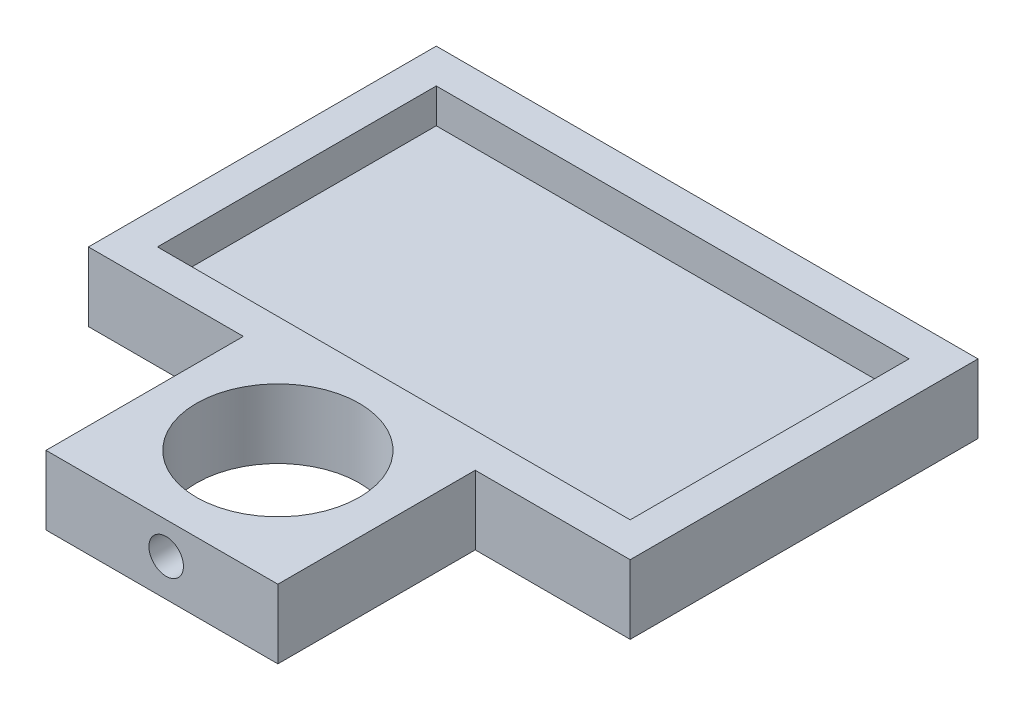
ISO-10303-21;
HEADER;
FILE_DESCRIPTION(('STEP AP214'),'2;1');
FILE_NAME('part.step','',(''),(''),'','','');
FILE_SCHEMA(('AUTOMOTIVE_DESIGN { 1 0 10303 214 1 1 1 1 }'));
ENDSEC;
DATA;
#1=APPLICATION_CONTEXT('core data for automotive mechanical design processes');
#2=APPLICATION_PROTOCOL_DEFINITION('international standard','automotive_design',2000,#1);
#3=PRODUCT_CONTEXT('',#1,'mechanical');
#4=PRODUCT('Part','Part','',(#3));
#5=PRODUCT_RELATED_PRODUCT_CATEGORY('part','',(#4));
#6=PRODUCT_DEFINITION_FORMATION('','',#4);
#7=PRODUCT_DEFINITION_CONTEXT('part definition',#1,'design');
#8=PRODUCT_DEFINITION('design','',#6,#7);
#9=PRODUCT_DEFINITION_SHAPE('','',#8);
#10=(LENGTH_UNIT() NAMED_UNIT(*) SI_UNIT(.MILLI.,.METRE.));
#11=(NAMED_UNIT(*) PLANE_ANGLE_UNIT() SI_UNIT($,.RADIAN.));
#12=(NAMED_UNIT(*) SI_UNIT($,.STERADIAN.) SOLID_ANGLE_UNIT());
#13=UNCERTAINTY_MEASURE_WITH_UNIT(LENGTH_MEASURE(1.E-05),#10,'distance_accuracy_value','');
#14=(GEOMETRIC_REPRESENTATION_CONTEXT(3) GLOBAL_UNCERTAINTY_ASSIGNED_CONTEXT((#13)) GLOBAL_UNIT_ASSIGNED_CONTEXT((#10,
#11,#12)) REPRESENTATION_CONTEXT('',''));
#15=CARTESIAN_POINT('',(0.,0.,0.));
#16=DIRECTION('',(0.,0.,1.));
#17=DIRECTION('',(1.,0.,0.));
#18=AXIS2_PLACEMENT_3D('',#15,#16,#17);
#19=CARTESIAN_POINT('',(-81.5702583075172,10.,4.99797501796837));
#20=DIRECTION('',(0.,0.,-1.));
#21=DIRECTION('',(-1.,0.,0.));
#22=AXIS2_PLACEMENT_3D('',#19,#20,#21);
#23=PLANE('',#22);
#24=DIRECTION('',(1.,0.,0.));
#25=VECTOR('',#24,1.);
#26=CARTESIAN_POINT('',(-81.5702583075172,10.,4.99797501796837));
#27=LINE('',#26,#25);
#28=CARTESIAN_POINT('',(-25.5202583075172,10.,4.99797501796837));
#29=VERTEX_POINT('',#28);
#30=CARTESIAN_POINT('',(-3.07025830751723,10.,4.99797501796837));
#31=VERTEX_POINT('',#30);
#32=EDGE_CURVE('E49',#29,#31,#27,.T.);
#33=ORIENTED_EDGE('',*,*,#32,.F.);
#34=DIRECTION('',(0.,-1.,0.));
#35=VECTOR('',#34,1.);
#36=CARTESIAN_POINT('',(-25.5202583075172,10.,4.99797501796837));
#37=LINE('',#36,#35);
#38=CARTESIAN_POINT('',(-25.5202583075172,0.,4.99797501796837));
#39=VERTEX_POINT('',#38);
#40=EDGE_CURVE('E160',#29,#39,#37,.T.);
#41=ORIENTED_EDGE('',*,*,#40,.T.);
#42=DIRECTION('',(1.,0.,0.));
#43=VECTOR('',#42,1.);
#44=CARTESIAN_POINT('',(-81.5702583075172,0.,4.99797501796837));
#45=LINE('',#44,#43);
#46=CARTESIAN_POINT('',(-3.07025830751723,0.,4.99797501796837));
#47=VERTEX_POINT('',#46);
#48=EDGE_CURVE('E205',#39,#47,#45,.T.);
#49=ORIENTED_EDGE('',*,*,#48,.T.);
#50=DIRECTION('',(0.,-1.,0.));
#51=VECTOR('',#50,1.);
#52=CARTESIAN_POINT('',(-3.07025830751723,10.,4.99797501796837));
#53=LINE('',#52,#51);
#54=EDGE_CURVE('E42',#31,#47,#53,.T.);
#55=ORIENTED_EDGE('',*,*,#54,.F.);
#56=EDGE_LOOP('',(#33,#41,#49,#55));
#57=FACE_BOUND('',#56,.T.);
#58=ADVANCED_FACE('F34',(#57),#23,.F.);
#59=CARTESIAN_POINT('',(-81.5702583075172,10.,-45.4020249820316));
#60=DIRECTION('',(1.,0.,0.));
#61=DIRECTION('',(0.,0.,-1.));
#62=AXIS2_PLACEMENT_3D('',#59,#60,#61);
#63=PLANE('',#62);
#64=DIRECTION('',(0.,0.,1.));
#65=VECTOR('',#64,1.);
#66=CARTESIAN_POINT('',(-81.5702583075172,0.,-45.4020249820316));
#67=LINE('',#66,#65);
#68=CARTESIAN_POINT('',(-81.5702583075172,0.,-45.4020249820316));
#69=VERTEX_POINT('',#68);
#70=CARTESIAN_POINT('',(-81.5702583075172,0.,4.99797501796837));
#71=VERTEX_POINT('',#70);
#72=EDGE_CURVE('E186',#69,#71,#67,.T.);
#73=ORIENTED_EDGE('',*,*,#72,.T.);
#74=DIRECTION('',(0.,-1.,0.));
#75=VECTOR('',#74,1.);
#76=CARTESIAN_POINT('',(-81.5702583075172,10.,4.99797501796837));
#77=LINE('',#76,#75);
#78=CARTESIAN_POINT('',(-81.5702583075172,10.,4.99797501796837));
#79=VERTEX_POINT('',#78);
#80=EDGE_CURVE('E11',#79,#71,#77,.T.);
#81=ORIENTED_EDGE('',*,*,#80,.F.);
#82=DIRECTION('',(0.,0.,1.));
#83=VECTOR('',#82,1.);
#84=CARTESIAN_POINT('',(-81.5702583075172,10.,-45.4020249820316));
#85=LINE('',#84,#83);
#86=CARTESIAN_POINT('',(-81.5702583075172,10.,-45.4020249820316));
#87=VERTEX_POINT('',#86);
#88=EDGE_CURVE('E194',#87,#79,#85,.T.);
#89=ORIENTED_EDGE('',*,*,#88,.F.);
#90=DIRECTION('',(0.,-1.,0.));
#91=VECTOR('',#90,1.);
#92=CARTESIAN_POINT('',(-81.5702583075172,10.,-45.4020249820316));
#93=LINE('',#92,#91);
#94=EDGE_CURVE('E202',#87,#69,#93,.T.);
#95=ORIENTED_EDGE('',*,*,#94,.T.);
#96=EDGE_LOOP('',(#73,#81,#89,#95));
#97=FACE_BOUND('',#96,.T.);
#98=ADVANCED_FACE('F36',(#97),#63,.F.);
#99=CARTESIAN_POINT('',(-59.1202583075172,0.,4.99797501796837));
#100=VERTEX_POINT('',#99);
#101=EDGE_CURVE('E206',#71,#100,#45,.T.);
#102=ORIENTED_EDGE('',*,*,#101,.T.);
#103=DIRECTION('',(0.,1.,0.));
#104=VECTOR('',#103,1.);
#105=CARTESIAN_POINT('',(-59.1202583075172,10.,4.99797501796837));
#106=LINE('',#105,#104);
#107=CARTESIAN_POINT('',(-59.1202583075172,10.,4.99797501796837));
#108=VERTEX_POINT('',#107);
#109=EDGE_CURVE('E57',#100,#108,#106,.T.);
#110=ORIENTED_EDGE('',*,*,#109,.T.);
#111=EDGE_CURVE('E131',#79,#108,#27,.T.);
#112=ORIENTED_EDGE('',*,*,#111,.F.);
#113=ORIENTED_EDGE('',*,*,#80,.T.);
#114=EDGE_LOOP('',(#102,#110,#112,#113));
#115=FACE_BOUND('',#114,.T.);
#116=ADVANCED_FACE('F236',(#115),#23,.F.);
#117=CARTESIAN_POINT('',(-3.07025830751724,10.,-45.4020249820316));
#118=DIRECTION('',(-1.,0.,0.));
#119=DIRECTION('',(0.,0.,1.));
#120=AXIS2_PLACEMENT_3D('',#117,#118,#119);
#121=PLANE('',#120);
#122=DIRECTION('',(0.,0.,-1.));
#123=VECTOR('',#122,1.);
#124=CARTESIAN_POINT('',(-3.07025830751724,0.,-45.4020249820316));
#125=LINE('',#124,#123);
#126=CARTESIAN_POINT('',(-3.07025830751724,0.,-45.4020249820316));
#127=VERTEX_POINT('',#126);
#128=EDGE_CURVE('E208',#47,#127,#125,.T.);
#129=ORIENTED_EDGE('',*,*,#128,.T.);
#130=DIRECTION('',(0.,-1.,0.));
#131=VECTOR('',#130,1.);
#132=CARTESIAN_POINT('',(-3.07025830751724,10.,-45.4020249820316));
#133=LINE('',#132,#131);
#134=CARTESIAN_POINT('',(-3.07025830751724,10.,-45.4020249820316));
#135=VERTEX_POINT('',#134);
#136=EDGE_CURVE('E213',#135,#127,#133,.T.);
#137=ORIENTED_EDGE('',*,*,#136,.F.);
#138=DIRECTION('',(0.,0.,-1.));
#139=VECTOR('',#138,1.);
#140=CARTESIAN_POINT('',(-3.07025830751724,10.,-45.4020249820316));
#141=LINE('',#140,#139);
#142=EDGE_CURVE('E198',#31,#135,#141,.T.);
#143=ORIENTED_EDGE('',*,*,#142,.F.);
#144=ORIENTED_EDGE('',*,*,#54,.T.);
#145=EDGE_LOOP('',(#129,#137,#143,#144));
#146=FACE_BOUND('',#145,.T.);
#147=ADVANCED_FACE('F219',(#146),#121,.F.);
#148=CARTESIAN_POINT('',(-81.5702583075172,10.,-45.4020249820316));
#149=DIRECTION('',(0.,0.,1.));
#150=DIRECTION('',(1.,0.,0.));
#151=AXIS2_PLACEMENT_3D('',#148,#149,#150);
#152=PLANE('',#151);
#153=DIRECTION('',(-1.,0.,0.));
#154=VECTOR('',#153,1.);
#155=CARTESIAN_POINT('',(-81.5702583075172,0.,-45.4020249820316));
#156=LINE('',#155,#154);
#157=EDGE_CURVE('E196',#127,#69,#156,.T.);
#158=ORIENTED_EDGE('',*,*,#157,.T.);
#159=ORIENTED_EDGE('',*,*,#94,.F.);
#160=DIRECTION('',(-1.,0.,0.));
#161=VECTOR('',#160,1.);
#162=CARTESIAN_POINT('',(-81.5702583075172,10.,-45.4020249820316));
#163=LINE('',#162,#161);
#164=EDGE_CURVE('E200',#135,#87,#163,.T.);
#165=ORIENTED_EDGE('',*,*,#164,.F.);
#166=ORIENTED_EDGE('',*,*,#136,.T.);
#167=EDGE_LOOP('',(#158,#159,#165,#166));
#168=FACE_BOUND('',#167,.T.);
#169=ADVANCED_FACE('F227',(#168),#152,.F.);
#170=CARTESIAN_POINT('',(0.,10.,0.));
#171=DIRECTION('',(0.,1.,0.));
#172=DIRECTION('',(0.,0.,1.));
#173=AXIS2_PLACEMENT_3D('',#170,#171,#172);
#174=PLANE('',#173);
#175=CARTESIAN_POINT('',(-42.3202583075172,10.,16.7979750179684));
#176=DIRECTION('',(0.,1.,0.));
#177=DIRECTION('',(0.,0.,1.));
#178=AXIS2_PLACEMENT_3D('',#175,#176,#177);
#179=CIRCLE('',#178,11.8);
#180=CARTESIAN_POINT('',(-42.3202583075172,10.,28.5979750179684));
#181=VERTEX_POINT('',#180);
#182=EDGE_CURVE('E133',#181,#181,#179,.T.);
#183=ORIENTED_EDGE('',*,*,#182,.F.);
#184=EDGE_LOOP('',(#183));
#185=FACE_BOUND('',#184,.T.);
#186=DIRECTION('',(0.,0.,-1.));
#187=VECTOR('',#186,1.);
#188=CARTESIAN_POINT('',(-8.07025830751723,10.,-40.4020249820316));
#189=LINE('',#188,#187);
#190=CARTESIAN_POINT('',(-8.07025830751723,10.,-0.00202498203162853));
#191=VERTEX_POINT('',#190);
#192=CARTESIAN_POINT('',(-8.07025830751723,10.,-40.4020249820316));
#193=VERTEX_POINT('',#192);
#194=EDGE_CURVE('E179',#191,#193,#189,.T.);
#195=ORIENTED_EDGE('',*,*,#194,.F.);
#196=DIRECTION('',(1.,0.,0.));
#197=VECTOR('',#196,1.);
#198=CARTESIAN_POINT('',(-76.5702583075172,10.,-0.00202498203162853));
#199=LINE('',#198,#197);
#200=CARTESIAN_POINT('',(-76.5702583075172,10.,-0.00202498203162853));
#201=VERTEX_POINT('',#200);
#202=EDGE_CURVE('E177',#201,#191,#199,.T.);
#203=ORIENTED_EDGE('',*,*,#202,.F.);
#204=DIRECTION('',(0.,0.,1.));
#205=VECTOR('',#204,1.);
#206=CARTESIAN_POINT('',(-76.5702583075172,10.,-40.4020249820316));
#207=LINE('',#206,#205);
#208=CARTESIAN_POINT('',(-76.5702583075172,10.,-40.4020249820316));
#209=VERTEX_POINT('',#208);
#210=EDGE_CURVE('E162',#209,#201,#207,.T.);
#211=ORIENTED_EDGE('',*,*,#210,.F.);
#212=DIRECTION('',(-1.,0.,0.));
#213=VECTOR('',#212,1.);
#214=CARTESIAN_POINT('',(-76.5702583075172,10.,-40.4020249820316));
#215=LINE('',#214,#213);
#216=EDGE_CURVE('E167',#193,#209,#215,.T.);
#217=ORIENTED_EDGE('',*,*,#216,.F.);
#218=EDGE_LOOP('',(#195,#203,#211,#217));
#219=FACE_BOUND('',#218,.T.);
#220=ORIENTED_EDGE('',*,*,#111,.T.);
#221=DIRECTION('',(0.,0.,1.));
#222=VECTOR('',#221,1.);
#223=CARTESIAN_POINT('',(-59.1202583075172,10.,-0.00202498203162853));
#224=LINE('',#223,#222);
#225=CARTESIAN_POINT('',(-59.1202583075172,10.,33.5979750179684));
#226=VERTEX_POINT('',#225);
#227=EDGE_CURVE('E124',#108,#226,#224,.T.);
#228=ORIENTED_EDGE('',*,*,#227,.T.);
#229=DIRECTION('',(1.,0.,0.));
#230=VECTOR('',#229,1.);
#231=CARTESIAN_POINT('',(-59.1202583075172,10.,33.5979750179684));
#232=LINE('',#231,#230);
#233=CARTESIAN_POINT('',(-25.5202583075172,10.,33.5979750179684));
#234=VERTEX_POINT('',#233);
#235=EDGE_CURVE('E129',#226,#234,#232,.T.);
#236=ORIENTED_EDGE('',*,*,#235,.T.);
#237=DIRECTION('',(0.,0.,-1.));
#238=VECTOR('',#237,1.);
#239=CARTESIAN_POINT('',(-25.5202583075172,10.,-0.00202498203162853));
#240=LINE('',#239,#238);
#241=EDGE_CURVE('E144',#234,#29,#240,.T.);
#242=ORIENTED_EDGE('',*,*,#241,.T.);
#243=ORIENTED_EDGE('',*,*,#32,.T.);
#244=ORIENTED_EDGE('',*,*,#142,.T.);
#245=ORIENTED_EDGE('',*,*,#164,.T.);
#246=ORIENTED_EDGE('',*,*,#88,.T.);
#247=EDGE_LOOP('',(#220,#228,#236,#242,#243,#244,#245,#246));
#248=FACE_BOUND('',#247,.T.);
#249=ADVANCED_FACE('F126',(#185,#219,#248),#174,.T.);
#250=CARTESIAN_POINT('',(0.,0.,0.));
#251=DIRECTION('',(0.,1.,0.));
#252=DIRECTION('',(0.,0.,1.));
#253=AXIS2_PLACEMENT_3D('',#250,#251,#252);
#254=PLANE('',#253);
#255=CARTESIAN_POINT('',(-42.3202583075172,0.,16.7979750179684));
#256=DIRECTION('',(0.,1.,0.));
#257=DIRECTION('',(0.,0.,1.));
#258=AXIS2_PLACEMENT_3D('',#255,#256,#257);
#259=CIRCLE('',#258,11.8);
#260=CARTESIAN_POINT('',(-42.3202583075172,0.,28.5979750179684));
#261=VERTEX_POINT('',#260);
#262=EDGE_CURVE('E155',#261,#261,#259,.F.);
#263=ORIENTED_EDGE('',*,*,#262,.F.);
#264=EDGE_LOOP('',(#263));
#265=FACE_BOUND('',#264,.T.);
#266=ORIENTED_EDGE('',*,*,#48,.F.);
#267=DIRECTION('',(0.,0.,1.));
#268=VECTOR('',#267,1.);
#269=CARTESIAN_POINT('',(-25.5202583075172,0.,-0.00202498203162853));
#270=LINE('',#269,#268);
#271=CARTESIAN_POINT('',(-25.5202583075172,0.,33.5979750179684));
#272=VERTEX_POINT('',#271);
#273=EDGE_CURVE('E153',#39,#272,#270,.T.);
#274=ORIENTED_EDGE('',*,*,#273,.T.);
#275=DIRECTION('',(-1.,0.,0.));
#276=VECTOR('',#275,1.);
#277=CARTESIAN_POINT('',(-59.1202583075172,0.,33.5979750179684));
#278=LINE('',#277,#276);
#279=CARTESIAN_POINT('',(-59.1202583075172,0.,33.5979750179684));
#280=VERTEX_POINT('',#279);
#281=EDGE_CURVE('E158',#272,#280,#278,.T.);
#282=ORIENTED_EDGE('',*,*,#281,.T.);
#283=DIRECTION('',(0.,0.,-1.));
#284=VECTOR('',#283,1.);
#285=CARTESIAN_POINT('',(-59.1202583075172,0.,-0.00202498203162853));
#286=LINE('',#285,#284);
#287=EDGE_CURVE('E140',#280,#100,#286,.T.);
#288=ORIENTED_EDGE('',*,*,#287,.T.);
#289=ORIENTED_EDGE('',*,*,#101,.F.);
#290=ORIENTED_EDGE('',*,*,#72,.F.);
#291=ORIENTED_EDGE('',*,*,#157,.F.);
#292=ORIENTED_EDGE('',*,*,#128,.F.);
#293=EDGE_LOOP('',(#266,#274,#282,#288,#289,#290,#291,#292));
#294=FACE_BOUND('',#293,.T.);
#295=ADVANCED_FACE('F223',(#265,#294),#254,.F.);
#296=CARTESIAN_POINT('',(-76.5702583075172,5.,-40.4020249820316));
#297=DIRECTION('',(-1.,0.,0.));
#298=DIRECTION('',(0.,0.,1.));
#299=AXIS2_PLACEMENT_3D('',#296,#297,#298);
#300=PLANE('',#299);
#301=ORIENTED_EDGE('',*,*,#210,.T.);
#302=DIRECTION('',(0.,1.,0.));
#303=VECTOR('',#302,1.);
#304=CARTESIAN_POINT('',(-76.5702583075172,5.,-0.00202498203162853));
#305=LINE('',#304,#303);
#306=CARTESIAN_POINT('',(-76.5702583075172,5.,-0.00202498203162853));
#307=VERTEX_POINT('',#306);
#308=EDGE_CURVE('E175',#307,#201,#305,.T.);
#309=ORIENTED_EDGE('',*,*,#308,.F.);
#310=DIRECTION('',(0.,0.,1.));
#311=VECTOR('',#310,1.);
#312=CARTESIAN_POINT('',(-76.5702583075172,5.,-40.4020249820316));
#313=LINE('',#312,#311);
#314=CARTESIAN_POINT('',(-76.5702583075172,5.,-40.4020249820316));
#315=VERTEX_POINT('',#314);
#316=EDGE_CURVE('E163',#315,#307,#313,.T.);
#317=ORIENTED_EDGE('',*,*,#316,.F.);
#318=DIRECTION('',(0.,1.,0.));
#319=VECTOR('',#318,1.);
#320=CARTESIAN_POINT('',(-76.5702583075172,5.,-40.4020249820316));
#321=LINE('',#320,#319);
#322=EDGE_CURVE('E184',#315,#209,#321,.T.);
#323=ORIENTED_EDGE('',*,*,#322,.T.);
#324=EDGE_LOOP('',(#301,#309,#317,#323));
#325=FACE_BOUND('',#324,.T.);
#326=ADVANCED_FACE('F294',(#325),#300,.F.);
#327=CARTESIAN_POINT('',(-76.5702583075172,5.,-40.4020249820316));
#328=DIRECTION('',(0.,0.,-1.));
#329=DIRECTION('',(-1.,0.,0.));
#330=AXIS2_PLACEMENT_3D('',#327,#328,#329);
#331=PLANE('',#330);
#332=ORIENTED_EDGE('',*,*,#216,.T.);
#333=ORIENTED_EDGE('',*,*,#322,.F.);
#334=DIRECTION('',(-1.,0.,0.));
#335=VECTOR('',#334,1.);
#336=CARTESIAN_POINT('',(-76.5702583075172,5.,-40.4020249820316));
#337=LINE('',#336,#335);
#338=CARTESIAN_POINT('',(-8.07025830751723,5.,-40.4020249820316));
#339=VERTEX_POINT('',#338);
#340=EDGE_CURVE('E172',#339,#315,#337,.T.);
#341=ORIENTED_EDGE('',*,*,#340,.F.);
#342=DIRECTION('',(0.,1.,0.));
#343=VECTOR('',#342,1.);
#344=CARTESIAN_POINT('',(-8.07025830751723,5.,-40.4020249820316));
#345=LINE('',#344,#343);
#346=EDGE_CURVE('E187',#339,#193,#345,.T.);
#347=ORIENTED_EDGE('',*,*,#346,.T.);
#348=EDGE_LOOP('',(#332,#333,#341,#347));
#349=FACE_BOUND('',#348,.T.);
#350=ADVANCED_FACE('F290',(#349),#331,.F.);
#351=CARTESIAN_POINT('',(-8.07025830751723,5.,-40.4020249820316));
#352=DIRECTION('',(1.,0.,0.));
#353=DIRECTION('',(0.,0.,-1.));
#354=AXIS2_PLACEMENT_3D('',#351,#352,#353);
#355=PLANE('',#354);
#356=ORIENTED_EDGE('',*,*,#194,.T.);
#357=ORIENTED_EDGE('',*,*,#346,.F.);
#358=DIRECTION('',(0.,0.,-1.));
#359=VECTOR('',#358,1.);
#360=CARTESIAN_POINT('',(-8.07025830751723,5.,-40.4020249820316));
#361=LINE('',#360,#359);
#362=CARTESIAN_POINT('',(-8.07025830751723,5.,-0.00202498203162853));
#363=VERTEX_POINT('',#362);
#364=EDGE_CURVE('E169',#363,#339,#361,.T.);
#365=ORIENTED_EDGE('',*,*,#364,.F.);
#366=DIRECTION('',(0.,1.,0.));
#367=VECTOR('',#366,1.);
#368=CARTESIAN_POINT('',(-8.07025830751723,5.,-0.00202498203162853));
#369=LINE('',#368,#367);
#370=EDGE_CURVE('E189',#363,#191,#369,.T.);
#371=ORIENTED_EDGE('',*,*,#370,.T.);
#372=EDGE_LOOP('',(#356,#357,#365,#371));
#373=FACE_BOUND('',#372,.T.);
#374=ADVANCED_FACE('F293',(#373),#355,.F.);
#375=CARTESIAN_POINT('',(-76.5702583075172,5.,-0.00202498203162853));
#376=DIRECTION('',(0.,0.,1.));
#377=DIRECTION('',(1.,0.,0.));
#378=AXIS2_PLACEMENT_3D('',#375,#376,#377);
#379=PLANE('',#378);
#380=ORIENTED_EDGE('',*,*,#202,.T.);
#381=ORIENTED_EDGE('',*,*,#370,.F.);
#382=DIRECTION('',(1.,0.,0.));
#383=VECTOR('',#382,1.);
#384=CARTESIAN_POINT('',(-76.5702583075172,5.,-0.00202498203162853));
#385=LINE('',#384,#383);
#386=EDGE_CURVE('E166',#307,#363,#385,.T.);
#387=ORIENTED_EDGE('',*,*,#386,.F.);
#388=ORIENTED_EDGE('',*,*,#308,.T.);
#389=EDGE_LOOP('',(#380,#381,#387,#388));
#390=FACE_BOUND('',#389,.T.);
#391=ADVANCED_FACE('F288',(#390),#379,.F.);
#392=CARTESIAN_POINT('',(0.,5.,0.));
#393=DIRECTION('',(0.,1.,0.));
#394=DIRECTION('',(0.,0.,1.));
#395=AXIS2_PLACEMENT_3D('',#392,#393,#394);
#396=PLANE('',#395);
#397=ORIENTED_EDGE('',*,*,#316,.T.);
#398=ORIENTED_EDGE('',*,*,#386,.T.);
#399=ORIENTED_EDGE('',*,*,#364,.T.);
#400=ORIENTED_EDGE('',*,*,#340,.T.);
#401=EDGE_LOOP('',(#397,#398,#399,#400));
#402=FACE_BOUND('',#401,.T.);
#403=ADVANCED_FACE('F285',(#402),#396,.T.);
#404=CARTESIAN_POINT('',(-25.5202583075172,-47.517575695736,-0.00202498203162853));
#405=DIRECTION('',(1.,0.,0.));
#406=DIRECTION('',(0.,0.,-1.));
#407=AXIS2_PLACEMENT_3D('',#404,#405,#406);
#408=PLANE('',#407);
#409=ORIENTED_EDGE('',*,*,#40,.F.);
#410=ORIENTED_EDGE('',*,*,#241,.F.);
#411=DIRECTION('',(0.,1.,0.));
#412=VECTOR('',#411,1.);
#413=CARTESIAN_POINT('',(-25.5202583075172,-47.517575695736,33.5979750179684));
#414=LINE('',#413,#412);
#415=EDGE_CURVE('E143',#272,#234,#414,.T.);
#416=ORIENTED_EDGE('',*,*,#415,.F.);
#417=ORIENTED_EDGE('',*,*,#273,.F.);
#418=EDGE_LOOP('',(#409,#410,#416,#417));
#419=FACE_BOUND('',#418,.T.);
#420=ADVANCED_FACE('F233',(#419),#408,.T.);
#421=CARTESIAN_POINT('',(-59.1202583075172,-47.517575695736,-0.00202498203162853));
#422=DIRECTION('',(-1.,0.,0.));
#423=DIRECTION('',(0.,0.,1.));
#424=AXIS2_PLACEMENT_3D('',#421,#422,#423);
#425=PLANE('',#424);
#426=ORIENTED_EDGE('',*,*,#109,.F.);
#427=ORIENTED_EDGE('',*,*,#287,.F.);
#428=DIRECTION('',(0.,1.,0.));
#429=VECTOR('',#428,1.);
#430=CARTESIAN_POINT('',(-59.1202583075172,-47.517575695736,33.5979750179684));
#431=LINE('',#430,#429);
#432=EDGE_CURVE('E137',#280,#226,#431,.T.);
#433=ORIENTED_EDGE('',*,*,#432,.T.);
#434=ORIENTED_EDGE('',*,*,#227,.F.);
#435=EDGE_LOOP('',(#426,#427,#433,#434));
#436=FACE_BOUND('',#435,.T.);
#437=ADVANCED_FACE('F138',(#436),#425,.T.);
#438=CARTESIAN_POINT('',(-59.1202583075172,-47.517575695736,33.5979750179684));
#439=DIRECTION('',(0.,0.,1.));
#440=DIRECTION('',(1.,0.,0.));
#441=AXIS2_PLACEMENT_3D('',#438,#439,#440);
#442=PLANE('',#441);
#443=CARTESIAN_POINT('',(-41.7045438921751,5.39331072032784,33.5979750179684));
#444=DIRECTION('',(0.,0.,1.));
#445=DIRECTION('',(1.,0.,0.));
#446=AXIS2_PLACEMENT_3D('',#443,#444,#445);
#447=CIRCLE('',#446,2.49999999999999);
#448=CARTESIAN_POINT('',(-39.2045438921751,5.39331072032784,33.5979750179684));
#449=VERTEX_POINT('',#448);
#450=EDGE_CURVE('E253',#449,#449,#447,.T.);
#451=ORIENTED_EDGE('',*,*,#450,.F.);
#452=EDGE_LOOP('',(#451));
#453=FACE_BOUND('',#452,.T.);
#454=ORIENTED_EDGE('',*,*,#281,.F.);
#455=ORIENTED_EDGE('',*,*,#415,.T.);
#456=ORIENTED_EDGE('',*,*,#235,.F.);
#457=ORIENTED_EDGE('',*,*,#432,.F.);
#458=EDGE_LOOP('',(#454,#455,#456,#457));
#459=FACE_BOUND('',#458,.T.);
#460=ADVANCED_FACE('F146',(#453,#459),#442,.T.);
#461=CARTESIAN_POINT('',(-42.3202583075172,-47.517575695736,16.7979750179684));
#462=DIRECTION('',(0.,1.,0.));
#463=DIRECTION('',(0.,0.,1.));
#464=AXIS2_PLACEMENT_3D('',#461,#462,#463);
#465=CYLINDRICAL_SURFACE('',#464,11.8);
#466=CARTESIAN_POINT('',(-42.3202583075172,2.97031757986297,28.5979750179684));
#467=CARTESIAN_POINT('',(-42.1862923475244,2.93627991589839,28.5979724616124));
#468=CARTESIAN_POINT('',(-42.0494405543814,2.91336579598863,28.5956708558377));
#469=CARTESIAN_POINT('',(-41.7739444751767,2.89044942557282,28.5861286666212));
#470=CARTESIAN_POINT('',(-41.6352991073017,2.8904617158051,28.5788849516301));
#471=CARTESIAN_POINT('',(-41.3603422220195,2.9132828405179,28.5596729540152));
#472=CARTESIAN_POINT('',(-41.2240289906454,2.9360741312741,28.5477083116044));
#473=CARTESIAN_POINT('',(-40.9574058076505,3.00360310240241,28.5197759012495));
#474=CARTESIAN_POINT('',(-40.8270956712558,3.04834010679564,28.5038082566145));
#475=CARTESIAN_POINT('',(-40.5744620011498,3.15899915340901,28.4688213408517));
#476=CARTESIAN_POINT('',(-40.452245824181,3.22515573877823,28.4497695099411));
#477=CARTESIAN_POINT('',(-40.2205724225157,3.37663248901171,28.4102594819463));
#478=CARTESIAN_POINT('',(-40.1111173294801,3.46195584862089,28.3898010508028));
#479=CARTESIAN_POINT('',(-39.9054334413622,3.65169642853116,28.3487276279924));
#480=CARTESIAN_POINT('',(-39.8095644796627,3.75650578055364,28.3281197605275));
#481=CARTESIAN_POINT('',(-39.6367604382832,3.98109770924844,28.2891328584576));
#482=CARTESIAN_POINT('',(-39.5598254879883,4.10088038823205,28.2707538390838));
#483=CARTESIAN_POINT('',(-39.4273781542002,4.35187284684016,28.2380758139575));
#484=CARTESIAN_POINT('',(-39.3718090198409,4.48305120413781,28.2237660264366));
#485=CARTESIAN_POINT('',(-39.2836605678654,4.75337216981711,28.2006577239578));
#486=CARTESIAN_POINT('',(-39.2510757455944,4.89251286261355,28.191857889444));
#487=CARTESIAN_POINT('',(-39.2106853842522,5.17024550497023,28.1809001074049));
#488=CARTESIAN_POINT('',(-39.2021528625229,5.30872422316162,28.1785473594616));
#489=CARTESIAN_POINT('',(-39.2080851730938,5.58514082120531,28.1801711573086));
#490=CARTESIAN_POINT('',(-39.2225475122794,5.72307875806399,28.184147016948));
#491=CARTESIAN_POINT('',(-39.2734871240671,5.99193626321526,28.1978808304721));
#492=CARTESIAN_POINT('',(-39.3095651895887,6.12293731024419,28.2075338779518));
#493=CARTESIAN_POINT('',(-39.4022317196607,6.37700209151971,28.2315832473583));
#494=CARTESIAN_POINT('',(-39.4588223544186,6.50006498429478,28.2459800711568));
#495=CARTESIAN_POINT('',(-39.5921322023533,6.73740970974357,28.2784848975055));
#496=CARTESIAN_POINT('',(-39.6692208539224,6.85147469061756,28.2966595211517));
#497=CARTESIAN_POINT('',(-39.8408488067596,7.06526778186963,28.3348828459495));
#498=CARTESIAN_POINT('',(-39.9353912697576,7.1649932888435,28.3549318863235));
#499=CARTESIAN_POINT('',(-40.1425917010382,7.350402428121,28.3957864553866));
#500=CARTESIAN_POINT('',(-40.255711071708,7.43557016720089,28.4165965246446));
#501=CARTESIAN_POINT('',(-40.4949030776859,7.5857316548184,28.4565668069135));
#502=CARTESIAN_POINT('',(-40.6209760724009,7.65072484339818,28.4757269741195));
#503=CARTESIAN_POINT('',(-40.8830757652766,7.75875698735756,28.5108748000235));
#504=CARTESIAN_POINT('',(-41.0191306022226,7.80173092128934,28.5268529785487));
#505=CARTESIAN_POINT('',(-41.2969911346814,7.86397088576185,28.5543517602598));
#506=CARTESIAN_POINT('',(-41.4387959148948,7.88324067443988,28.5658730698545));
#507=CARTESIAN_POINT('',(-41.7206805000348,7.89714734797684,28.5835593053134));
#508=CARTESIAN_POINT('',(-41.8607258711042,7.8923360837228,28.5898404158686));
#509=CARTESIAN_POINT('',(-42.1381743744051,7.85937561404893,28.5973861526155));
#510=CARTESIAN_POINT('',(-42.2755777277352,7.83122837028663,28.5986512004134));
#511=CARTESIAN_POINT('',(-42.5417770638899,7.75297453977332,28.596636356268));
#512=CARTESIAN_POINT('',(-42.6706685634395,7.70319031057857,28.5934217098041));
#513=CARTESIAN_POINT('',(-42.9183999975749,7.58317376868292,28.5834581045095));
#514=CARTESIAN_POINT('',(-43.0372393328617,7.51294023792447,28.5767089351266));
#515=CARTESIAN_POINT('',(-43.2627483652444,7.35322768170048,28.5608246772222));
#516=CARTESIAN_POINT('',(-43.3692892553342,7.26356910236721,28.5516671457768));
#517=CARTESIAN_POINT('',(-43.5660089809147,7.06788517631001,28.5324496411504));
#518=CARTESIAN_POINT('',(-43.656186343944,6.96185835828795,28.5223895868781));
#519=CARTESIAN_POINT('',(-43.8189071598785,6.73467739644557,28.502712712904));
#520=CARTESIAN_POINT('',(-43.8911809027119,6.61332914927743,28.4931042562774));
#521=CARTESIAN_POINT('',(-44.0143401978223,6.36009073504691,28.4759017572546));
#522=CARTESIAN_POINT('',(-44.0652263911087,6.22820088406947,28.4683076544885));
#523=CARTESIAN_POINT('',(-44.1439847760793,5.95799752569397,28.4562604100309));
#524=CARTESIAN_POINT('',(-44.1719242327388,5.81970405768392,28.4517980936041));
#525=CARTESIAN_POINT('',(-44.2041751748584,5.54032433706508,28.4466286615858));
#526=CARTESIAN_POINT('',(-44.2084885195882,5.39923830509563,28.4459212505001));
#527=CARTESIAN_POINT('',(-44.1934442652284,5.11998586136157,28.4483495091037));
#528=CARTESIAN_POINT('',(-44.1743553311391,4.98180449371036,28.4514415607818));
#529=CARTESIAN_POINT('',(-44.1135416010612,4.7106408647336,28.4609536774116));
#530=CARTESIAN_POINT('',(-44.0718166827704,4.57765863150312,28.4673737603447));
#531=CARTESIAN_POINT('',(-43.9668462330212,4.32030344294107,28.4826466201758));
#532=CARTESIAN_POINT('',(-43.9035547996614,4.19594953718786,28.4915045780185));
#533=CARTESIAN_POINT('',(-43.7572396804662,3.95951433041744,28.5103832005229));
#534=CARTESIAN_POINT('',(-43.6742114735737,3.84743584990879,28.5204041313146));
#535=CARTESIAN_POINT('',(-43.4895886706801,3.63734701738142,28.5402649754725));
#536=CARTESIAN_POINT('',(-43.3877833809486,3.53952147371091,28.55010127735));
#537=CARTESIAN_POINT('',(-43.1691269632138,3.36235889879188,28.5679114910003));
#538=CARTESIAN_POINT('',(-43.0522872235689,3.28300799981268,28.5758867997113));
#539=CARTESIAN_POINT('',(-42.8340142912046,3.16030017901408,28.5871748017002));
#540=CARTESIAN_POINT('',(-42.7348820518309,3.11286418509201,28.5911283867747));
#541=CARTESIAN_POINT('',(-42.5311923676235,3.03138710260148,28.5965294600636));
#542=CARTESIAN_POINT('',(-42.4266351385459,2.99734548178943,28.597977047865));
#543=CARTESIAN_POINT('',(-42.3202583075172,2.97031757986297,28.5979750179684));
#544=B_SPLINE_CURVE_WITH_KNOTS('',3,(#466,#467,#468,#469,#470,#471,#472,#473,#474,#475,#476,
#477,#478,#479,#480,#481,#482,#483,#484,#485,#486,#487,#488,#489,#490,#491,#492,#493,#494,#495,
#496,#497,#498,#499,#500,#501,#502,#503,#504,#505,#506,#507,#508,#509,#510,#511,#512,#513,#514,
#515,#516,#517,#518,#519,#520,#521,#522,#523,#524,#525,#526,#527,#528,#529,#530,#531,#532,#533,
#534,#535,#536,#537,#538,#539,#540,#541,#542,#543),.UNSPECIFIED.,.T.,.F.,(4,2,2,2,2,2,2,2,2,2,2,
2,2,2,2,2,2,2,2,2,2,2,2,2,2,2,2,2,2,2,2,2,2,2,2,2,2,2,4),(0.,0.414270190505446,
0.828803125873831,1.24301704584947,1.65721820787671,2.07611759805955,2.49508686285979,
2.92364022719308,3.35219651994984,3.77960650585004,4.20691409390396,4.62116017728954,
5.03536135096265,5.44213902429247,5.84895974682702,6.26367829115001,6.67847203491445,
7.10581063311262,7.53316109131233,7.96176631879262,8.390303584954,8.80906590981737,
9.22779303645878,9.64048485796018,10.0532012663777,10.4699090438058,10.8866542998378,
11.3093405521695,11.7320141352079,12.153444245667,12.5748411909783,12.991445351674,
13.4080517633044,13.8255504714705,14.2431449074158,14.6657467760156,15.0880303943309,
15.4169983010741,15.7459531345106),.UNSPECIFIED.);
#545=CARTESIAN_POINT('',(-42.3202583075172,2.97031757986297,28.5979750179684));
#546=VERTEX_POINT('',#545);
#547=EDGE_CURVE('E249',#546,#546,#544,.T.);
#548=ORIENTED_EDGE('',*,*,#547,.T.);
#549=EDGE_LOOP('',(#548));
#550=FACE_BOUND('',#549,.T.);
#551=ORIENTED_EDGE('',*,*,#182,.T.);
#552=EDGE_LOOP('',(#551));
#553=FACE_BOUND('',#552,.T.);
#554=ORIENTED_EDGE('',*,*,#262,.T.);
#555=EDGE_LOOP('',(#554));
#556=FACE_BOUND('',#555,.T.);
#557=ADVANCED_FACE('F269',(#550,#553,#556),#465,.F.);
#558=CARTESIAN_POINT('',(-41.7045438921751,5.39331072032784,33.5979750179684));
#559=DIRECTION('',(0.,0.,1.));
#560=DIRECTION('',(1.,0.,0.));
#561=AXIS2_PLACEMENT_3D('',#558,#559,#560);
#562=CYLINDRICAL_SURFACE('',#561,2.49999999999999);
#563=ORIENTED_EDGE('',*,*,#547,.F.);
#564=EDGE_LOOP('',(#563));
#565=FACE_BOUND('',#564,.T.);
#566=ORIENTED_EDGE('',*,*,#450,.T.);
#567=EDGE_LOOP('',(#566));
#568=FACE_BOUND('',#567,.T.);
#569=ADVANCED_FACE('F266',(#565,#568),#562,.F.);
#570=CLOSED_SHELL('',(#58,#98,#116,#147,#169,#249,#295,#326,#350,#374,#391,#403,#420,#437,#460,
#557,#569));
#571=MANIFOLD_SOLID_BREP('B2',#570);
#572=ADVANCED_BREP_SHAPE_REPRESENTATION('',(#18,#571),#14);
#573=SHAPE_DEFINITION_REPRESENTATION(#9,#572);
ENDSEC;
END-ISO-10303-21;
